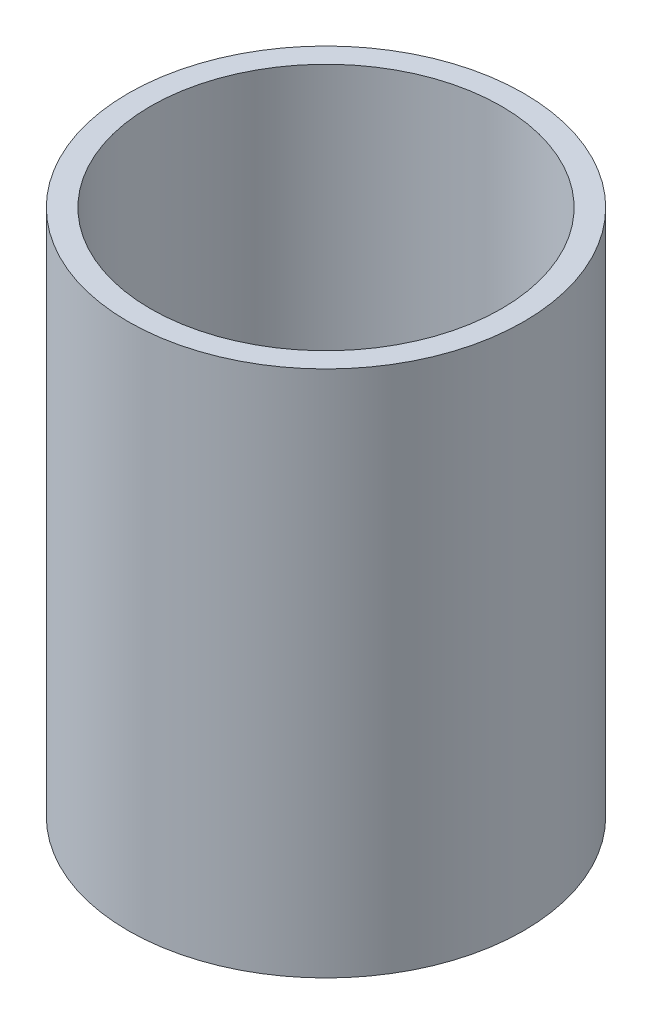
ISO-10303-21;
HEADER;
FILE_DESCRIPTION(('STEP AP214'),'2;1');
FILE_NAME('part.step','',(''),(''),'','','');
FILE_SCHEMA(('AUTOMOTIVE_DESIGN { 1 0 10303 214 1 1 1 1 }'));
ENDSEC;
DATA;
#1=APPLICATION_CONTEXT('core data for automotive mechanical design processes');
#2=APPLICATION_PROTOCOL_DEFINITION('international standard','automotive_design',2000,#1);
#3=PRODUCT_CONTEXT('',#1,'mechanical');
#4=PRODUCT('Part','Part','',(#3));
#5=PRODUCT_RELATED_PRODUCT_CATEGORY('part','',(#4));
#6=PRODUCT_DEFINITION_FORMATION('','',#4);
#7=PRODUCT_DEFINITION_CONTEXT('part definition',#1,'design');
#8=PRODUCT_DEFINITION('design','',#6,#7);
#9=PRODUCT_DEFINITION_SHAPE('','',#8);
#10=(LENGTH_UNIT() NAMED_UNIT(*) SI_UNIT(.MILLI.,.METRE.));
#11=(NAMED_UNIT(*) PLANE_ANGLE_UNIT() SI_UNIT($,.RADIAN.));
#12=(NAMED_UNIT(*) SI_UNIT($,.STERADIAN.) SOLID_ANGLE_UNIT());
#13=UNCERTAINTY_MEASURE_WITH_UNIT(LENGTH_MEASURE(1.E-05),#10,'distance_accuracy_value','');
#14=(GEOMETRIC_REPRESENTATION_CONTEXT(3) GLOBAL_UNCERTAINTY_ASSIGNED_CONTEXT((#13)) GLOBAL_UNIT_ASSIGNED_CONTEXT((#10,
#11,#12)) REPRESENTATION_CONTEXT('',''));
#15=CARTESIAN_POINT('',(0.,0.,0.));
#16=DIRECTION('',(0.,0.,1.));
#17=DIRECTION('',(1.,0.,0.));
#18=AXIS2_PLACEMENT_3D('',#15,#16,#17);
#19=CARTESIAN_POINT('',(0.,76.2,0.));
#20=DIRECTION('',(0.,1.,0.));
#21=DIRECTION('',(0.,0.,1.));
#22=AXIS2_PLACEMENT_3D('',#19,#20,#21);
#23=PLANE('',#22);
#24=CARTESIAN_POINT('',(0.,76.2,0.));
#25=DIRECTION('',(0.,1.,0.));
#26=DIRECTION('',(0.,0.,1.));
#27=AXIS2_PLACEMENT_3D('',#24,#25,#26);
#28=CIRCLE('',#27,57.15);
#29=CARTESIAN_POINT('',(0.,76.2,-57.15));
#30=VERTEX_POINT('',#29);
#31=EDGE_CURVE('E10',#30,#30,#28,.T.);
#32=ORIENTED_EDGE('',*,*,#31,.T.);
#33=EDGE_LOOP('',(#32));
#34=FACE_BOUND('',#33,.T.);
#35=CARTESIAN_POINT('',(0.,76.2,0.));
#36=DIRECTION('',(0.,1.,0.));
#37=DIRECTION('',(0.,0.,1.));
#38=AXIS2_PLACEMENT_3D('',#35,#36,#37);
#39=CIRCLE('',#38,50.7);
#40=CARTESIAN_POINT('',(0.,76.2,-50.7));
#41=VERTEX_POINT('',#40);
#42=EDGE_CURVE('E42',#41,#41,#39,.T.);
#43=ORIENTED_EDGE('',*,*,#42,.F.);
#44=EDGE_LOOP('',(#43));
#45=FACE_BOUND('',#44,.T.);
#46=ADVANCED_FACE('F31',(#34,#45),#23,.T.);
#47=CARTESIAN_POINT('',(0.,-76.2,0.));
#48=DIRECTION('',(0.,1.,0.));
#49=DIRECTION('',(0.,0.,1.));
#50=AXIS2_PLACEMENT_3D('',#47,#48,#49);
#51=PLANE('',#50);
#52=CARTESIAN_POINT('',(0.,-76.2,0.));
#53=DIRECTION('',(0.,1.,0.));
#54=DIRECTION('',(0.,0.,1.));
#55=AXIS2_PLACEMENT_3D('',#52,#53,#54);
#56=CIRCLE('',#55,57.15);
#57=CARTESIAN_POINT('',(0.,-76.2,-57.15));
#58=VERTEX_POINT('',#57);
#59=EDGE_CURVE('E35',#58,#58,#56,.T.);
#60=ORIENTED_EDGE('',*,*,#59,.F.);
#61=EDGE_LOOP('',(#60));
#62=FACE_BOUND('',#61,.T.);
#63=CARTESIAN_POINT('',(0.,-76.2,0.));
#64=DIRECTION('',(0.,1.,0.));
#65=DIRECTION('',(0.,0.,1.));
#66=AXIS2_PLACEMENT_3D('',#63,#64,#65);
#67=CIRCLE('',#66,50.7);
#68=CARTESIAN_POINT('',(0.,-76.2,-50.7));
#69=VERTEX_POINT('',#68);
#70=EDGE_CURVE('E44',#69,#69,#67,.T.);
#71=ORIENTED_EDGE('',*,*,#70,.T.);
#72=EDGE_LOOP('',(#71));
#73=FACE_BOUND('',#72,.T.);
#74=ADVANCED_FACE('F54',(#62,#73),#51,.F.);
#75=CARTESIAN_POINT('',(0.,76.2,0.));
#76=DIRECTION('',(0.,-1.,0.));
#77=DIRECTION('',(0.,0.,-1.));
#78=AXIS2_PLACEMENT_3D('',#75,#76,#77);
#79=CYLINDRICAL_SURFACE('',#78,57.15);
#80=CARTESIAN_POINT('',(0.,76.2,-57.15));
#81=CARTESIAN_POINT('',(0.,74.6125,-57.15));
#82=CARTESIAN_POINT('',(0.,73.025,-57.15));
#83=CARTESIAN_POINT('',(0.,69.85,-57.15));
#84=CARTESIAN_POINT('',(0.,68.2625,-57.15));
#85=CARTESIAN_POINT('',(0.,65.0875,-57.15));
#86=CARTESIAN_POINT('',(0.,63.5,-57.15));
#87=CARTESIAN_POINT('',(0.,60.325,-57.15));
#88=CARTESIAN_POINT('',(0.,58.7375,-57.15));
#89=CARTESIAN_POINT('',(0.,55.5625,-57.15));
#90=CARTESIAN_POINT('',(0.,53.975,-57.15));
#91=CARTESIAN_POINT('',(0.,50.8,-57.15));
#92=CARTESIAN_POINT('',(0.,49.2125,-57.15));
#93=CARTESIAN_POINT('',(0.,46.0375,-57.15));
#94=CARTESIAN_POINT('',(0.,44.45,-57.15));
#95=CARTESIAN_POINT('',(0.,41.275,-57.15));
#96=CARTESIAN_POINT('',(0.,39.6875,-57.15));
#97=CARTESIAN_POINT('',(0.,36.5125,-57.15));
#98=CARTESIAN_POINT('',(0.,34.925,-57.15));
#99=CARTESIAN_POINT('',(0.,31.75,-57.15));
#100=CARTESIAN_POINT('',(0.,30.1625,-57.15));
#101=CARTESIAN_POINT('',(0.,26.9875,-57.15));
#102=CARTESIAN_POINT('',(0.,25.4,-57.15));
#103=CARTESIAN_POINT('',(0.,22.225,-57.15));
#104=CARTESIAN_POINT('',(0.,20.6375,-57.15));
#105=CARTESIAN_POINT('',(0.,17.4625,-57.15));
#106=CARTESIAN_POINT('',(0.,15.875,-57.15));
#107=CARTESIAN_POINT('',(0.,12.7,-57.15));
#108=CARTESIAN_POINT('',(0.,11.1125,-57.15));
#109=CARTESIAN_POINT('',(0.,7.93750000000001,-57.15));
#110=CARTESIAN_POINT('',(0.,6.35,-57.15));
#111=CARTESIAN_POINT('',(0.,3.175,-57.15));
#112=CARTESIAN_POINT('',(0.,1.5875,-57.15));
#113=CARTESIAN_POINT('',(0.,-1.5875,-57.15));
#114=CARTESIAN_POINT('',(0.,-3.175,-57.15));
#115=CARTESIAN_POINT('',(0.,-6.35,-57.15));
#116=CARTESIAN_POINT('',(0.,-7.93750000000001,-57.15));
#117=CARTESIAN_POINT('',(0.,-11.1125,-57.15));
#118=CARTESIAN_POINT('',(0.,-12.7,-57.15));
#119=CARTESIAN_POINT('',(0.,-15.875,-57.15));
#120=CARTESIAN_POINT('',(0.,-17.4625,-57.15));
#121=CARTESIAN_POINT('',(0.,-20.6375,-57.15));
#122=CARTESIAN_POINT('',(0.,-22.225,-57.15));
#123=CARTESIAN_POINT('',(0.,-25.4,-57.15));
#124=CARTESIAN_POINT('',(0.,-26.9875,-57.15));
#125=CARTESIAN_POINT('',(0.,-30.1625,-57.15));
#126=CARTESIAN_POINT('',(0.,-31.75,-57.15));
#127=CARTESIAN_POINT('',(0.,-34.925,-57.15));
#128=CARTESIAN_POINT('',(0.,-36.5125,-57.15));
#129=CARTESIAN_POINT('',(0.,-39.6875,-57.15));
#130=CARTESIAN_POINT('',(0.,-41.275,-57.15));
#131=CARTESIAN_POINT('',(0.,-44.45,-57.15));
#132=CARTESIAN_POINT('',(0.,-46.0375,-57.15));
#133=CARTESIAN_POINT('',(0.,-49.2125,-57.15));
#134=CARTESIAN_POINT('',(0.,-50.8,-57.15));
#135=CARTESIAN_POINT('',(0.,-53.975,-57.15));
#136=CARTESIAN_POINT('',(0.,-55.5625,-57.15));
#137=CARTESIAN_POINT('',(0.,-58.7375,-57.15));
#138=CARTESIAN_POINT('',(0.,-60.325,-57.15));
#139=CARTESIAN_POINT('',(0.,-63.5,-57.15));
#140=CARTESIAN_POINT('',(0.,-65.0875,-57.15));
#141=CARTESIAN_POINT('',(0.,-68.2625,-57.15));
#142=CARTESIAN_POINT('',(0.,-69.85,-57.15));
#143=CARTESIAN_POINT('',(0.,-73.025,-57.15));
#144=CARTESIAN_POINT('',(0.,-74.6125,-57.15));
#145=CARTESIAN_POINT('',(0.,-76.2,-57.15));
#146=B_SPLINE_CURVE_WITH_KNOTS('',3,(#80,#81,#82,#83,#84,#85,#86,#87,#88,#89,#90,#91,#92,#93,
#94,#95,#96,#97,#98,#99,#100,#101,#102,#103,#104,#105,#106,#107,#108,#109,#110,#111,#112,#113,
#114,#115,#116,#117,#118,#119,#120,#121,#122,#123,#124,#125,#126,#127,#128,#129,#130,#131,#132,
#133,#134,#135,#136,#137,#138,#139,#140,#141,#142,#143,#144,#145),.UNSPECIFIED.,.F.,.F.,(4,2,2,
2,2,2,2,2,2,2,2,2,2,2,2,2,2,2,2,2,2,2,2,2,2,2,2,2,2,2,2,2,4),(0.,4.7625,9.52500000000001,
14.2875,19.05,23.8125,28.575,33.3375,38.1,42.8625,47.625,52.3875,57.15,61.9125,66.675,71.4375,
76.2,80.9625,85.725,90.4875,95.25,100.0125,104.775,109.5375,114.3,119.0625,123.825,128.5875,
133.35,138.1125,142.875,147.6375,152.4),.UNSPECIFIED.);
#147=EDGE_CURVE('BSEAM33',#30,#58,#146,.T.);
#148=ORIENTED_EDGE('',*,*,#31,.F.);
#149=ORIENTED_EDGE('',*,*,#59,.T.);
#150=ORIENTED_EDGE('',*,*,#147,.T.);
#151=ORIENTED_EDGE('',*,*,#147,.F.);
#152=EDGE_LOOP('',(#148,#150,#149,#151));
#153=FACE_BOUND('',#152,.T.);
#154=ADVANCED_FACE('F33',(#153),#79,.T.);
#155=CARTESIAN_POINT('',(0.,76.2,0.));
#156=DIRECTION('',(0.,-1.,0.));
#157=DIRECTION('',(0.,0.,-1.));
#158=AXIS2_PLACEMENT_3D('',#155,#156,#157);
#159=CYLINDRICAL_SURFACE('',#158,50.7);
#160=CARTESIAN_POINT('',(0.,76.2,-50.7));
#161=CARTESIAN_POINT('',(0.,74.6125,-50.7));
#162=CARTESIAN_POINT('',(0.,73.025,-50.7));
#163=CARTESIAN_POINT('',(0.,69.85,-50.7));
#164=CARTESIAN_POINT('',(0.,68.2625,-50.7));
#165=CARTESIAN_POINT('',(0.,65.0875,-50.7));
#166=CARTESIAN_POINT('',(0.,63.5,-50.7));
#167=CARTESIAN_POINT('',(0.,60.325,-50.7));
#168=CARTESIAN_POINT('',(0.,58.7375,-50.7));
#169=CARTESIAN_POINT('',(0.,55.5625,-50.7));
#170=CARTESIAN_POINT('',(0.,53.975,-50.7));
#171=CARTESIAN_POINT('',(0.,50.8,-50.7));
#172=CARTESIAN_POINT('',(0.,49.2125,-50.7));
#173=CARTESIAN_POINT('',(0.,46.0375,-50.7));
#174=CARTESIAN_POINT('',(0.,44.45,-50.7));
#175=CARTESIAN_POINT('',(0.,41.275,-50.7));
#176=CARTESIAN_POINT('',(0.,39.6875,-50.7));
#177=CARTESIAN_POINT('',(0.,36.5125,-50.7));
#178=CARTESIAN_POINT('',(0.,34.925,-50.7));
#179=CARTESIAN_POINT('',(0.,31.75,-50.7));
#180=CARTESIAN_POINT('',(0.,30.1625,-50.7));
#181=CARTESIAN_POINT('',(0.,26.9875,-50.7));
#182=CARTESIAN_POINT('',(0.,25.4,-50.7));
#183=CARTESIAN_POINT('',(0.,22.225,-50.7));
#184=CARTESIAN_POINT('',(0.,20.6375,-50.7));
#185=CARTESIAN_POINT('',(0.,17.4625,-50.7));
#186=CARTESIAN_POINT('',(0.,15.875,-50.7));
#187=CARTESIAN_POINT('',(0.,12.7,-50.7));
#188=CARTESIAN_POINT('',(0.,11.1125,-50.7));
#189=CARTESIAN_POINT('',(0.,7.93749999999999,-50.7));
#190=CARTESIAN_POINT('',(0.,6.34999999999999,-50.7));
#191=CARTESIAN_POINT('',(0.,3.17499999999999,-50.7));
#192=CARTESIAN_POINT('',(0.,1.58749999999999,-50.7));
#193=CARTESIAN_POINT('',(0.,-1.58750000000001,-50.7));
#194=CARTESIAN_POINT('',(0.,-3.17500000000002,-50.7));
#195=CARTESIAN_POINT('',(0.,-6.35000000000002,-50.7));
#196=CARTESIAN_POINT('',(0.,-7.93750000000002,-50.7));
#197=CARTESIAN_POINT('',(0.,-11.1125,-50.7));
#198=CARTESIAN_POINT('',(0.,-12.7,-50.7));
#199=CARTESIAN_POINT('',(0.,-15.875,-50.7));
#200=CARTESIAN_POINT('',(0.,-17.4625,-50.7));
#201=CARTESIAN_POINT('',(0.,-20.6375,-50.7));
#202=CARTESIAN_POINT('',(0.,-22.225,-50.7));
#203=CARTESIAN_POINT('',(0.,-25.4,-50.7));
#204=CARTESIAN_POINT('',(0.,-26.9875,-50.7));
#205=CARTESIAN_POINT('',(0.,-30.1625,-50.7));
#206=CARTESIAN_POINT('',(0.,-31.75,-50.7));
#207=CARTESIAN_POINT('',(0.,-34.925,-50.7));
#208=CARTESIAN_POINT('',(0.,-36.5125,-50.7));
#209=CARTESIAN_POINT('',(0.,-39.6875,-50.7));
#210=CARTESIAN_POINT('',(0.,-41.275,-50.7));
#211=CARTESIAN_POINT('',(0.,-44.45,-50.7));
#212=CARTESIAN_POINT('',(0.,-46.0375,-50.7));
#213=CARTESIAN_POINT('',(0.,-49.2125,-50.7));
#214=CARTESIAN_POINT('',(0.,-50.8,-50.7));
#215=CARTESIAN_POINT('',(0.,-53.975,-50.7));
#216=CARTESIAN_POINT('',(0.,-55.5625,-50.7));
#217=CARTESIAN_POINT('',(0.,-58.7375,-50.7));
#218=CARTESIAN_POINT('',(0.,-60.325,-50.7));
#219=CARTESIAN_POINT('',(0.,-63.5,-50.7));
#220=CARTESIAN_POINT('',(0.,-65.0875,-50.7));
#221=CARTESIAN_POINT('',(0.,-68.2625,-50.7));
#222=CARTESIAN_POINT('',(0.,-69.85,-50.7));
#223=CARTESIAN_POINT('',(0.,-73.025,-50.7));
#224=CARTESIAN_POINT('',(0.,-74.6125,-50.7));
#225=CARTESIAN_POINT('',(0.,-76.2,-50.7));
#226=B_SPLINE_CURVE_WITH_KNOTS('',3,(#160,#161,#162,#163,#164,#165,#166,#167,#168,#169,#170,
#171,#172,#173,#174,#175,#176,#177,#178,#179,#180,#181,#182,#183,#184,#185,#186,#187,#188,#189,
#190,#191,#192,#193,#194,#195,#196,#197,#198,#199,#200,#201,#202,#203,#204,#205,#206,#207,#208,
#209,#210,#211,#212,#213,#214,#215,#216,#217,#218,#219,#220,#221,#222,#223,#224,#225),
.UNSPECIFIED.,.F.,.F.,(4,2,2,2,2,2,2,2,2,2,2,2,2,2,2,2,2,2,2,2,2,2,2,2,2,2,2,2,2,2,2,2,4),(0.,
4.76249999999999,9.52499999999999,14.2875,19.05,23.8125,28.575,33.3375,38.1,42.8625,47.625,
52.3875,57.15,61.9125,66.675,71.4375,76.2,80.9625,85.725,90.4875,95.25,100.0125,104.775,
109.5375,114.3,119.0625,123.825,128.5875,133.35,138.1125,142.875,147.6375,152.4),.UNSPECIFIED.);
#227=EDGE_CURVE('BSEAM50',#41,#69,#226,.T.);
#228=ORIENTED_EDGE('',*,*,#42,.T.);
#229=ORIENTED_EDGE('',*,*,#70,.F.);
#230=ORIENTED_EDGE('',*,*,#227,.T.);
#231=ORIENTED_EDGE('',*,*,#227,.F.);
#232=EDGE_LOOP('',(#228,#230,#229,#231));
#233=FACE_BOUND('',#232,.T.);
#234=ADVANCED_FACE('F50',(#233),#159,.F.);
#235=CLOSED_SHELL('',(#46,#74,#154,#234));
#236=MANIFOLD_SOLID_BREP('B2',#235);
#237=ADVANCED_BREP_SHAPE_REPRESENTATION('',(#18,#236),#14);
#238=SHAPE_DEFINITION_REPRESENTATION(#9,#237);
ENDSEC;
END-ISO-10303-21;
